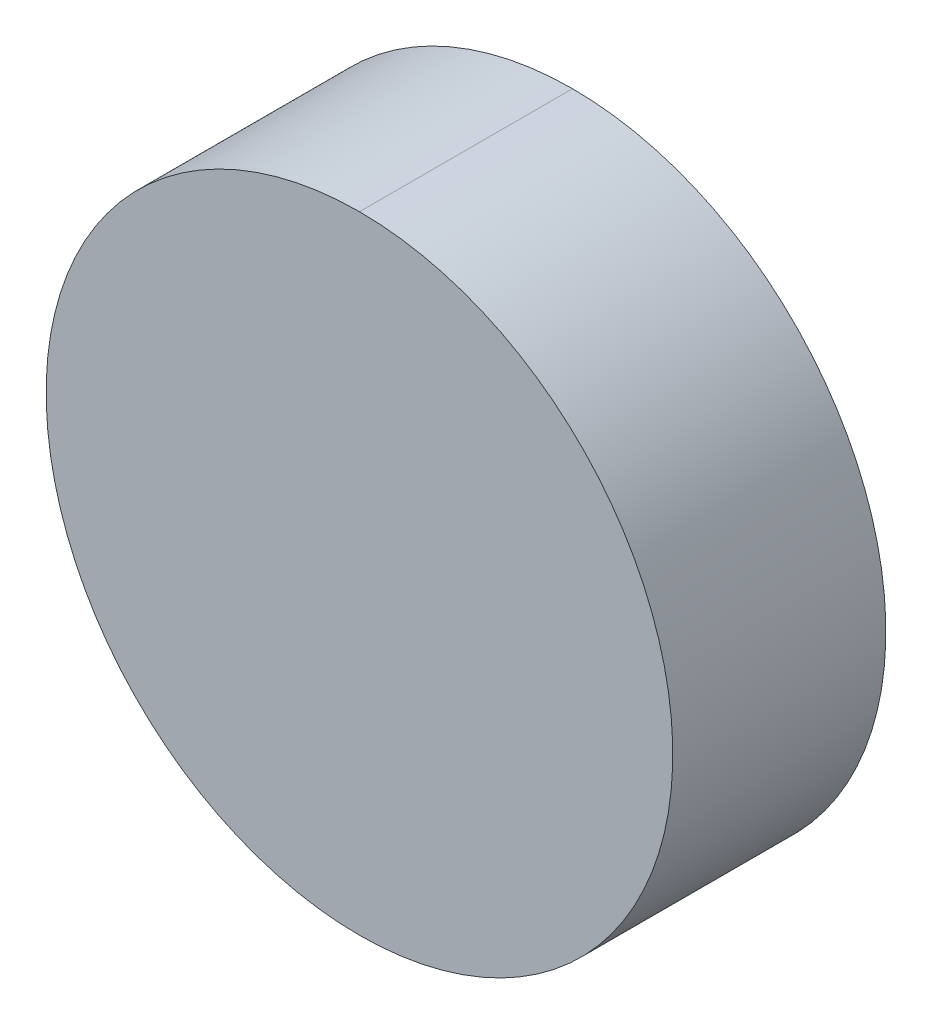
ISO-10303-21;
HEADER;
FILE_DESCRIPTION(('STEP AP214'),'2;1');
FILE_NAME('part.step','',(''),(''),'','','');
FILE_SCHEMA(('AUTOMOTIVE_DESIGN { 1 0 10303 214 1 1 1 1 }'));
ENDSEC;
DATA;
#1=APPLICATION_CONTEXT('core data for automotive mechanical design processes');
#2=APPLICATION_PROTOCOL_DEFINITION('international standard','automotive_design',2000,#1);
#3=PRODUCT_CONTEXT('',#1,'mechanical');
#4=PRODUCT('Part','Part','',(#3));
#5=PRODUCT_RELATED_PRODUCT_CATEGORY('part','',(#4));
#6=PRODUCT_DEFINITION_FORMATION('','',#4);
#7=PRODUCT_DEFINITION_CONTEXT('part definition',#1,'design');
#8=PRODUCT_DEFINITION('design','',#6,#7);
#9=PRODUCT_DEFINITION_SHAPE('','',#8);
#10=(LENGTH_UNIT() NAMED_UNIT(*) SI_UNIT(.MILLI.,.METRE.));
#11=(NAMED_UNIT(*) PLANE_ANGLE_UNIT() SI_UNIT($,.RADIAN.));
#12=(NAMED_UNIT(*) SI_UNIT($,.STERADIAN.) SOLID_ANGLE_UNIT());
#13=UNCERTAINTY_MEASURE_WITH_UNIT(LENGTH_MEASURE(1.E-05),#10,'distance_accuracy_value','');
#14=(GEOMETRIC_REPRESENTATION_CONTEXT(3) GLOBAL_UNCERTAINTY_ASSIGNED_CONTEXT((#13)) GLOBAL_UNIT_ASSIGNED_CONTEXT((#10,
#11,#12)) REPRESENTATION_CONTEXT('',''));
#15=CARTESIAN_POINT('',(0.,0.,0.));
#16=DIRECTION('',(0.,0.,1.));
#17=DIRECTION('',(1.,0.,0.));
#18=AXIS2_PLACEMENT_3D('',#15,#16,#17);
#19=CARTESIAN_POINT('',(0.,0.,3.4));
#20=DIRECTION('',(0.,0.,1.));
#21=DIRECTION('',(1.,0.,0.));
#22=AXIS2_PLACEMENT_3D('',#19,#20,#21);
#23=PLANE('',#22);
#24=CARTESIAN_POINT('',(0.,0.,3.4));
#25=DIRECTION('',(0.,0.,1.));
#26=DIRECTION('',(0.,1.,0.));
#27=AXIS2_PLACEMENT_3D('',#24,#25,#26);
#28=CIRCLE('',#27,5.);
#29=CARTESIAN_POINT('',(0.,5.,3.4));
#30=VERTEX_POINT('',#29);
#31=CARTESIAN_POINT('',(0.,-5.,3.4));
#32=VERTEX_POINT('',#31);
#33=EDGE_CURVE('E11',#30,#32,#28,.T.);
#34=ORIENTED_EDGE('',*,*,#33,.T.);
#35=CARTESIAN_POINT('',(0.,0.,3.4));
#36=DIRECTION('',(0.,0.,1.));
#37=DIRECTION('',(0.,-1.,0.));
#38=AXIS2_PLACEMENT_3D('',#35,#36,#37);
#39=CIRCLE('',#38,5.);
#40=EDGE_CURVE('E59',#32,#30,#39,.T.);
#41=ORIENTED_EDGE('',*,*,#40,.T.);
#42=EDGE_LOOP('',(#34,#41));
#43=FACE_BOUND('',#42,.T.);
#44=ADVANCED_FACE('F16',(#43),#23,.T.);
#45=CARTESIAN_POINT('',(0.,0.,0.));
#46=DIRECTION('',(0.,0.,1.));
#47=DIRECTION('',(0.,-1.,0.));
#48=AXIS2_PLACEMENT_3D('',#45,#46,#47);
#49=CYLINDRICAL_SURFACE('',#48,5.);
#50=DIRECTION('',(0.,0.,1.));
#51=VECTOR('',#50,1.);
#52=CARTESIAN_POINT('',(0.,-5.,0.));
#53=LINE('',#52,#51);
#54=CARTESIAN_POINT('',(0.,-5.,0.));
#55=VERTEX_POINT('',#54);
#56=EDGE_CURVE('E19',#55,#32,#53,.T.);
#57=ORIENTED_EDGE('',*,*,#56,.T.);
#58=ORIENTED_EDGE('',*,*,#33,.F.);
#59=DIRECTION('',(0.,0.,1.));
#60=VECTOR('',#59,1.);
#61=CARTESIAN_POINT('',(0.,5.,0.));
#62=LINE('',#61,#60);
#63=CARTESIAN_POINT('',(0.,5.,0.));
#64=VERTEX_POINT('',#63);
#65=EDGE_CURVE('E54',#64,#30,#62,.T.);
#66=ORIENTED_EDGE('',*,*,#65,.F.);
#67=CARTESIAN_POINT('',(0.,0.,0.));
#68=DIRECTION('',(0.,0.,1.));
#69=DIRECTION('',(0.,1.,0.));
#70=AXIS2_PLACEMENT_3D('',#67,#68,#69);
#71=CIRCLE('',#70,5.);
#72=EDGE_CURVE('E57',#64,#55,#71,.T.);
#73=ORIENTED_EDGE('',*,*,#72,.T.);
#74=EDGE_LOOP('',(#57,#58,#66,#73));
#75=FACE_BOUND('',#74,.T.);
#76=ADVANCED_FACE('F55',(#75),#49,.T.);
#77=CARTESIAN_POINT('',(0.,0.,0.));
#78=DIRECTION('',(0.,0.,1.));
#79=DIRECTION('',(0.,-1.,0.));
#80=AXIS2_PLACEMENT_3D('',#77,#78,#79);
#81=CYLINDRICAL_SURFACE('',#80,5.);
#82=ORIENTED_EDGE('',*,*,#65,.T.);
#83=ORIENTED_EDGE('',*,*,#40,.F.);
#84=ORIENTED_EDGE('',*,*,#56,.F.);
#85=CARTESIAN_POINT('',(0.,0.,0.));
#86=DIRECTION('',(0.,0.,1.));
#87=DIRECTION('',(0.,-1.,0.));
#88=AXIS2_PLACEMENT_3D('',#85,#86,#87);
#89=CIRCLE('',#88,5.);
#90=EDGE_CURVE('E60',#55,#64,#89,.T.);
#91=ORIENTED_EDGE('',*,*,#90,.T.);
#92=EDGE_LOOP('',(#82,#83,#84,#91));
#93=FACE_BOUND('',#92,.T.);
#94=ADVANCED_FACE('F62',(#93),#81,.T.);
#95=CARTESIAN_POINT('',(0.,0.,0.));
#96=DIRECTION('',(0.,0.,1.));
#97=DIRECTION('',(1.,0.,0.));
#98=AXIS2_PLACEMENT_3D('',#95,#96,#97);
#99=PLANE('',#98);
#100=ORIENTED_EDGE('',*,*,#72,.F.);
#101=ORIENTED_EDGE('',*,*,#90,.F.);
#102=EDGE_LOOP('',(#100,#101));
#103=FACE_BOUND('',#102,.T.);
#104=ADVANCED_FACE('F66',(#103),#99,.F.);
#105=CLOSED_SHELL('',(#44,#76,#94,#104));
#106=MANIFOLD_SOLID_BREP('B1',#105);
#107=ADVANCED_BREP_SHAPE_REPRESENTATION('',(#18,#106),#14);
#108=SHAPE_DEFINITION_REPRESENTATION(#9,#107);
ENDSEC;
END-ISO-10303-21;
